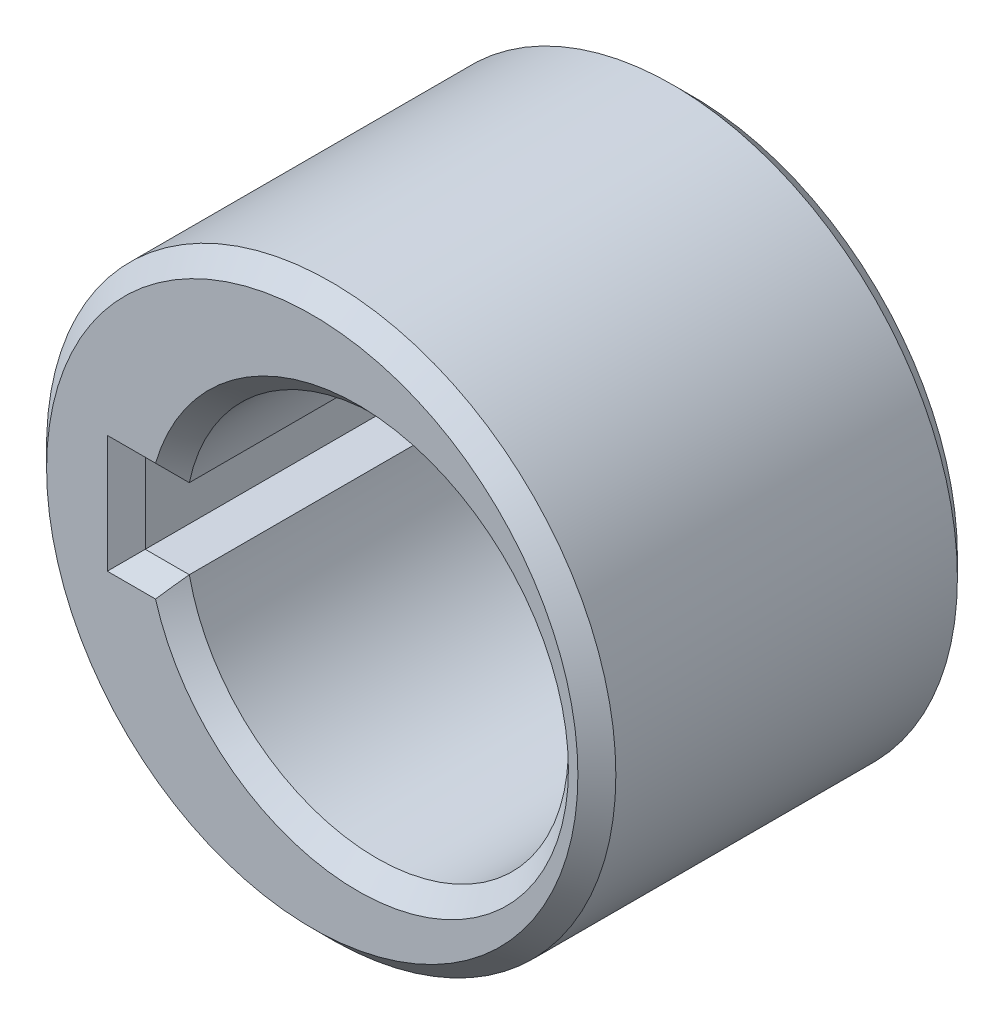
ISO-10303-21;
HEADER;
FILE_DESCRIPTION(('STEP AP214'),'2;1');
FILE_NAME('part.step','',(''),(''),'','','');
FILE_SCHEMA(('AUTOMOTIVE_DESIGN { 1 0 10303 214 1 1 1 1 }'));
ENDSEC;
DATA;
#1=APPLICATION_CONTEXT('core data for automotive mechanical design processes');
#2=APPLICATION_PROTOCOL_DEFINITION('international standard','automotive_design',2000,#1);
#3=PRODUCT_CONTEXT('',#1,'mechanical');
#4=PRODUCT('Part','Part','',(#3));
#5=PRODUCT_RELATED_PRODUCT_CATEGORY('part','',(#4));
#6=PRODUCT_DEFINITION_FORMATION('','',#4);
#7=PRODUCT_DEFINITION_CONTEXT('part definition',#1,'design');
#8=PRODUCT_DEFINITION('design','',#6,#7);
#9=PRODUCT_DEFINITION_SHAPE('','',#8);
#10=(LENGTH_UNIT() NAMED_UNIT(*) SI_UNIT(.MILLI.,.METRE.));
#11=(NAMED_UNIT(*) PLANE_ANGLE_UNIT() SI_UNIT($,.RADIAN.));
#12=(NAMED_UNIT(*) SI_UNIT($,.STERADIAN.) SOLID_ANGLE_UNIT());
#13=UNCERTAINTY_MEASURE_WITH_UNIT(LENGTH_MEASURE(1.E-05),#10,'distance_accuracy_value','');
#14=(GEOMETRIC_REPRESENTATION_CONTEXT(3) GLOBAL_UNCERTAINTY_ASSIGNED_CONTEXT((#13)) GLOBAL_UNIT_ASSIGNED_CONTEXT((#10,
#11,#12)) REPRESENTATION_CONTEXT('',''));
#15=CARTESIAN_POINT('',(0.,0.,0.));
#16=DIRECTION('',(0.,0.,1.));
#17=DIRECTION('',(1.,0.,0.));
#18=AXIS2_PLACEMENT_3D('',#15,#16,#17);
#19=CARTESIAN_POINT('',(-1.2,0.,10.));
#20=DIRECTION('',(0.,0.,1.));
#21=DIRECTION('',(1.,0.,0.));
#22=AXIS2_PLACEMENT_3D('',#19,#20,#21);
#23=PLANE('',#22);
#24=CARTESIAN_POINT('',(-1.2,0.,10.));
#25=DIRECTION('',(0.,0.,1.));
#26=DIRECTION('',(1.,0.,0.));
#27=AXIS2_PLACEMENT_3D('',#24,#25,#26);
#28=CIRCLE('',#27,7.);
#29=CARTESIAN_POINT('',(5.8,0.,10.));
#30=VERTEX_POINT('',#29);
#31=EDGE_CURVE('E11',#30,#30,#28,.T.);
#32=ORIENTED_EDGE('',*,*,#31,.T.);
#33=EDGE_LOOP('',(#32));
#34=FACE_BOUND('',#33,.T.);
#35=DIRECTION('',(-1.,0.,0.));
#36=VECTOR('',#35,1.);
#37=CARTESIAN_POINT('',(-6.1,-1.55000000000001,10.));
#38=LINE('',#37,#36);
#39=CARTESIAN_POINT('',(-5.3291650377897,-1.55,10.));
#40=VERTEX_POINT('',#39);
#41=CARTESIAN_POINT('',(-6.60000000000001,-1.55000000000001,10.));
#42=VERTEX_POINT('',#41);
#43=EDGE_CURVE('E141',#40,#42,#38,.T.);
#44=ORIENTED_EDGE('',*,*,#43,.T.);
#45=DIRECTION('',(0.,1.,0.));
#46=VECTOR('',#45,1.);
#47=CARTESIAN_POINT('',(-6.60000000000001,1.05,10.));
#48=LINE('',#47,#46);
#49=CARTESIAN_POINT('',(-6.60000000000001,1.55000000000001,10.));
#50=VERTEX_POINT('',#49);
#51=EDGE_CURVE('E123',#42,#50,#48,.T.);
#52=ORIENTED_EDGE('',*,*,#51,.T.);
#53=DIRECTION('',(1.,0.,0.));
#54=VECTOR('',#53,1.);
#55=CARTESIAN_POINT('',(-4.93963561409139,1.55000000000001,10.));
#56=LINE('',#55,#54);
#57=CARTESIAN_POINT('',(-5.3291650377897,1.55,10.));
#58=VERTEX_POINT('',#57);
#59=EDGE_CURVE('E147',#50,#58,#56,.T.);
#60=ORIENTED_EDGE('',*,*,#59,.T.);
#61=CARTESIAN_POINT('',(0.,0.,10.));
#62=DIRECTION('',(0.,0.,1.));
#63=DIRECTION('',(1.,0.,0.));
#64=AXIS2_PLACEMENT_3D('',#61,#62,#63);
#65=CIRCLE('',#64,5.55000000000001);
#66=EDGE_CURVE('E138',#58,#40,#65,.F.);
#67=ORIENTED_EDGE('',*,*,#66,.T.);
#68=EDGE_LOOP('',(#44,#52,#60,#67));
#69=FACE_BOUND('',#68,.T.);
#70=ADVANCED_FACE('F41',(#34,#69),#23,.T.);
#71=CARTESIAN_POINT('',(-1.2,0.,0.));
#72=DIRECTION('',(0.,0.,1.));
#73=DIRECTION('',(1.,0.,0.));
#74=AXIS2_PLACEMENT_3D('',#71,#72,#73);
#75=PLANE('',#74);
#76=CARTESIAN_POINT('',(-1.2,0.,0.));
#77=DIRECTION('',(0.,0.,1.));
#78=DIRECTION('',(1.,0.,0.));
#79=AXIS2_PLACEMENT_3D('',#76,#77,#78);
#80=CIRCLE('',#79,6.99999999999999);
#81=CARTESIAN_POINT('',(5.79999999999999,0.,0.));
#82=VERTEX_POINT('',#81);
#83=EDGE_CURVE('E50',#82,#82,#80,.F.);
#84=ORIENTED_EDGE('',*,*,#83,.T.);
#85=EDGE_LOOP('',(#84));
#86=FACE_BOUND('',#85,.T.);
#87=DIRECTION('',(1.,0.,0.));
#88=VECTOR('',#87,1.);
#89=CARTESIAN_POINT('',(-1.2,-1.55,0.));
#90=LINE('',#89,#88);
#91=CARTESIAN_POINT('',(-6.6,-1.55,0.));
#92=VERTEX_POINT('',#91);
#93=CARTESIAN_POINT('',(-5.32916503778969,-1.55,0.));
#94=VERTEX_POINT('',#93);
#95=EDGE_CURVE('E392',#92,#94,#90,.T.);
#96=ORIENTED_EDGE('',*,*,#95,.T.);
#97=CARTESIAN_POINT('',(0.,0.,0.));
#98=DIRECTION('',(0.,0.,1.));
#99=DIRECTION('',(1.,0.,0.));
#100=AXIS2_PLACEMENT_3D('',#97,#98,#99);
#101=CIRCLE('',#100,5.55);
#102=CARTESIAN_POINT('',(-5.32916503778969,1.55,0.));
#103=VERTEX_POINT('',#102);
#104=EDGE_CURVE('E388',#94,#103,#101,.T.);
#105=ORIENTED_EDGE('',*,*,#104,.T.);
#106=DIRECTION('',(-1.,0.,0.));
#107=VECTOR('',#106,1.);
#108=CARTESIAN_POINT('',(-1.2,1.55,0.));
#109=LINE('',#108,#107);
#110=CARTESIAN_POINT('',(-6.6,1.55,0.));
#111=VERTEX_POINT('',#110);
#112=EDGE_CURVE('E411',#103,#111,#109,.T.);
#113=ORIENTED_EDGE('',*,*,#112,.T.);
#114=DIRECTION('',(0.,-1.,0.));
#115=VECTOR('',#114,1.);
#116=CARTESIAN_POINT('',(-6.6,0.,0.));
#117=LINE('',#116,#115);
#118=EDGE_CURVE('E152',#111,#92,#117,.T.);
#119=ORIENTED_EDGE('',*,*,#118,.T.);
#120=EDGE_LOOP('',(#96,#105,#113,#119));
#121=FACE_BOUND('',#120,.T.);
#122=ADVANCED_FACE('F246',(#86,#121),#75,.F.);
#123=CARTESIAN_POINT('',(-1.2,0.,10.));
#124=DIRECTION('',(0.,0.,-1.));
#125=DIRECTION('',(-1.,0.,0.));
#126=AXIS2_PLACEMENT_3D('',#123,#124,#125);
#127=CYLINDRICAL_SURFACE('',#126,7.49999999999999);
#128=CARTESIAN_POINT('',(-1.2,0.,0.499999999999999));
#129=DIRECTION('',(0.,0.,1.));
#130=DIRECTION('',(1.,0.,0.));
#131=AXIS2_PLACEMENT_3D('',#128,#129,#130);
#132=CIRCLE('',#131,7.49999999999999);
#133=CARTESIAN_POINT('',(6.29999999999999,0.,0.499999999999999));
#134=VERTEX_POINT('',#133);
#135=EDGE_CURVE('E397',#134,#134,#132,.T.);
#136=ORIENTED_EDGE('',*,*,#135,.T.);
#137=EDGE_LOOP('',(#136));
#138=FACE_BOUND('',#137,.T.);
#139=CARTESIAN_POINT('',(-1.2,0.,9.5));
#140=DIRECTION('',(0.,0.,1.));
#141=DIRECTION('',(1.,0.,0.));
#142=AXIS2_PLACEMENT_3D('',#139,#140,#141);
#143=CIRCLE('',#142,7.49999999999999);
#144=CARTESIAN_POINT('',(6.29999999999999,0.,9.5));
#145=VERTEX_POINT('',#144);
#146=EDGE_CURVE('E395',#145,#145,#143,.F.);
#147=ORIENTED_EDGE('',*,*,#146,.T.);
#148=EDGE_LOOP('',(#147));
#149=FACE_BOUND('',#148,.T.);
#150=ADVANCED_FACE('F252',(#138,#149),#127,.T.);
#151=CARTESIAN_POINT('',(0.,0.,10.));
#152=DIRECTION('',(0.,0.,-1.));
#153=DIRECTION('',(-1.,0.,0.));
#154=AXIS2_PLACEMENT_3D('',#151,#152,#153);
#155=CYLINDRICAL_SURFACE('',#154,5.05);
#156=DIRECTION('',(0.,0.,-1.));
#157=VECTOR('',#156,1.);
#158=CARTESIAN_POINT('',(-4.93963561409139,1.05,10.));
#159=LINE('',#158,#157);
#160=CARTESIAN_POINT('',(-4.93963561409139,1.05,0.5));
#161=VERTEX_POINT('',#160);
#162=CARTESIAN_POINT('',(-4.93963561409139,1.05,9.5));
#163=VERTEX_POINT('',#162);
#164=EDGE_CURVE('E112',#161,#163,#159,.F.);
#165=ORIENTED_EDGE('',*,*,#164,.F.);
#166=CARTESIAN_POINT('',(0.,0.,0.5));
#167=DIRECTION('',(0.,0.,1.));
#168=DIRECTION('',(1.,0.,0.));
#169=AXIS2_PLACEMENT_3D('',#166,#167,#168);
#170=CIRCLE('',#169,5.05);
#171=CARTESIAN_POINT('',(-4.93963561409139,-1.05,0.5));
#172=VERTEX_POINT('',#171);
#173=EDGE_CURVE('E386',#161,#172,#170,.F.);
#174=ORIENTED_EDGE('',*,*,#173,.T.);
#175=DIRECTION('',(0.,0.,-1.));
#176=VECTOR('',#175,1.);
#177=CARTESIAN_POINT('',(-4.93963561409139,-1.05,10.));
#178=LINE('',#177,#176);
#179=CARTESIAN_POINT('',(-4.93963561409139,-1.05,9.5));
#180=VERTEX_POINT('',#179);
#181=EDGE_CURVE('E139',#180,#172,#178,.T.);
#182=ORIENTED_EDGE('',*,*,#181,.F.);
#183=CARTESIAN_POINT('',(0.,0.,9.5));
#184=DIRECTION('',(0.,0.,1.));
#185=DIRECTION('',(1.,0.,0.));
#186=AXIS2_PLACEMENT_3D('',#183,#184,#185);
#187=CIRCLE('',#186,5.05);
#188=EDGE_CURVE('E133',#180,#163,#187,.T.);
#189=ORIENTED_EDGE('',*,*,#188,.T.);
#190=EDGE_LOOP('',(#165,#174,#182,#189));
#191=FACE_BOUND('',#190,.T.);
#192=ADVANCED_FACE('F257',(#191),#155,.F.);
#193=CARTESIAN_POINT('',(0.,-1.05,0.));
#194=DIRECTION('',(0.,-1.,0.));
#195=DIRECTION('',(1.,0.,0.));
#196=AXIS2_PLACEMENT_3D('',#193,#194,#195);
#197=PLANE('',#196);
#198=ORIENTED_EDGE('',*,*,#181,.T.);
#199=DIRECTION('',(-1.,0.,0.));
#200=VECTOR('',#199,1.);
#201=CARTESIAN_POINT('',(0.,-1.05,0.5));
#202=LINE('',#201,#200);
#203=CARTESIAN_POINT('',(-6.1,-1.05,0.5));
#204=VERTEX_POINT('',#203);
#205=EDGE_CURVE('E65',#172,#204,#202,.T.);
#206=ORIENTED_EDGE('',*,*,#205,.T.);
#207=DIRECTION('',(0.,0.,1.));
#208=VECTOR('',#207,1.);
#209=CARTESIAN_POINT('',(-6.1,-1.05,0.));
#210=LINE('',#209,#208);
#211=CARTESIAN_POINT('',(-6.1,-1.05,9.5));
#212=VERTEX_POINT('',#211);
#213=EDGE_CURVE('E105',#204,#212,#210,.T.);
#214=ORIENTED_EDGE('',*,*,#213,.T.);
#215=DIRECTION('',(1.,0.,0.));
#216=VECTOR('',#215,1.);
#217=CARTESIAN_POINT('',(-4.93963561409139,-1.05,9.5));
#218=LINE('',#217,#216);
#219=EDGE_CURVE('E109',#212,#180,#218,.T.);
#220=ORIENTED_EDGE('',*,*,#219,.T.);
#221=EDGE_LOOP('',(#198,#206,#214,#220));
#222=FACE_BOUND('',#221,.T.);
#223=ADVANCED_FACE('F107',(#222),#197,.F.);
#224=CARTESIAN_POINT('',(-6.1,1.05,0.));
#225=DIRECTION('',(-1.,0.,0.));
#226=DIRECTION('',(0.,0.,1.));
#227=AXIS2_PLACEMENT_3D('',#224,#225,#226);
#228=PLANE('',#227);
#229=ORIENTED_EDGE('',*,*,#213,.F.);
#230=DIRECTION('',(0.,1.,0.));
#231=VECTOR('',#230,1.);
#232=CARTESIAN_POINT('',(-6.1,1.05,0.5));
#233=LINE('',#232,#231);
#234=CARTESIAN_POINT('',(-6.1,1.05,0.5));
#235=VERTEX_POINT('',#234);
#236=EDGE_CURVE('E57',#204,#235,#233,.T.);
#237=ORIENTED_EDGE('',*,*,#236,.T.);
#238=DIRECTION('',(0.,0.,1.));
#239=VECTOR('',#238,1.);
#240=CARTESIAN_POINT('',(-6.1,1.05,0.));
#241=LINE('',#240,#239);
#242=CARTESIAN_POINT('',(-6.1,1.05,9.5));
#243=VERTEX_POINT('',#242);
#244=EDGE_CURVE('E113',#235,#243,#241,.T.);
#245=ORIENTED_EDGE('',*,*,#244,.T.);
#246=DIRECTION('',(0.,-1.,0.));
#247=VECTOR('',#246,1.);
#248=CARTESIAN_POINT('',(-6.1,-1.05,9.5));
#249=LINE('',#248,#247);
#250=EDGE_CURVE('E121',#243,#212,#249,.T.);
#251=ORIENTED_EDGE('',*,*,#250,.T.);
#252=EDGE_LOOP('',(#229,#237,#245,#251));
#253=FACE_BOUND('',#252,.T.);
#254=ADVANCED_FACE('F136',(#253),#228,.F.);
#255=CARTESIAN_POINT('',(0.,1.05,0.));
#256=DIRECTION('',(0.,1.,0.));
#257=DIRECTION('',(-1.,0.,0.));
#258=AXIS2_PLACEMENT_3D('',#255,#256,#257);
#259=PLANE('',#258);
#260=ORIENTED_EDGE('',*,*,#244,.F.);
#261=DIRECTION('',(1.,0.,0.));
#262=VECTOR('',#261,1.);
#263=CARTESIAN_POINT('',(0.,1.05,0.5));
#264=LINE('',#263,#262);
#265=EDGE_CURVE('E383',#235,#161,#264,.T.);
#266=ORIENTED_EDGE('',*,*,#265,.T.);
#267=ORIENTED_EDGE('',*,*,#164,.T.);
#268=DIRECTION('',(-1.,0.,0.));
#269=VECTOR('',#268,1.);
#270=CARTESIAN_POINT('',(-6.1,1.05,9.5));
#271=LINE('',#270,#269);
#272=EDGE_CURVE('E134',#163,#243,#271,.T.);
#273=ORIENTED_EDGE('',*,*,#272,.T.);
#274=EDGE_LOOP('',(#260,#266,#267,#273));
#275=FACE_BOUND('',#274,.T.);
#276=ADVANCED_FACE('F291',(#275),#259,.F.);
#277=CARTESIAN_POINT('',(0.,0.,9.5));
#278=DIRECTION('',(0.,0.,1.));
#279=DIRECTION('',(1.,0.,0.));
#280=AXIS2_PLACEMENT_3D('',#277,#278,#279);
#281=CONICAL_SURFACE('',#280,5.05,0.785398163397452);
#282=CARTESIAN_POINT('',(-4.93963561409139,-1.05,9.5));
#283=CARTESIAN_POINT('',(-4.97306727438379,-1.09128547069311,9.5412854706931));
#284=CARTESIAN_POINT('',(-5.00624373290037,-1.1326740882986,9.5826740882986));
#285=CARTESIAN_POINT('',(-5.07210348665936,-1.2156435789909,9.66564357899089));
#286=CARTESIAN_POINT('',(-5.10478681344634,-1.25722443955614,9.70722443955613));
#287=CARTESIAN_POINT('',(-5.16968159226311,-1.34056937418893,9.79056937418892));
#288=CARTESIAN_POINT('',(-5.20189304781298,-1.38233344688673,9.83233344688672));
#289=CARTESIAN_POINT('',(-5.26586408278406,-1.46603776209883,9.91603776209882));
#290=CARTESIAN_POINT('',(-5.29762363304362,-1.507978015758,9.95797801575799));
#291=CARTESIAN_POINT('',(-5.32916503779029,-1.54999999999978,9.99999999999977));
#292=B_SPLINE_CURVE_WITH_KNOTS('',3,(#282,#283,#284,#285,#286,#287,#288,#289,#290,#291),
.UNSPECIFIED.,.F.,.F.,(4,2,2,2,4),(0.,0.201840325274075,0.403667684050677,0.605493536465258,
0.807332354265636),.UNSPECIFIED.);
#293=EDGE_CURVE('E132',#40,#180,#292,.F.);
#294=ORIENTED_EDGE('',*,*,#293,.F.);
#295=ORIENTED_EDGE('',*,*,#66,.F.);
#296=CARTESIAN_POINT('',(-5.32916503778972,1.55000000000001,10.));
#297=CARTESIAN_POINT('',(-5.29762363304341,1.50797801575809,9.95797801575808));
#298=CARTESIAN_POINT('',(-5.26586408278401,1.46603776209885,9.91603776209885));
#299=CARTESIAN_POINT('',(-5.20189304781305,1.38233344688671,9.8323334468867));
#300=CARTESIAN_POINT('',(-5.16968159226314,1.34056937418892,9.79056937418891));
#301=CARTESIAN_POINT('',(-5.10478681344632,1.25722443955615,9.70722443955614));
#302=CARTESIAN_POINT('',(-5.07210348665933,1.21564357899091,9.66564357899091));
#303=CARTESIAN_POINT('',(-5.0062437329004,1.13267408829859,9.58267408829859));
#304=CARTESIAN_POINT('',(-4.9730672743839,1.09128547069307,9.54128547069307));
#305=CARTESIAN_POINT('',(-4.93963561409164,1.0499999999999,9.4999999999999));
#306=B_SPLINE_CURVE_WITH_KNOTS('',3,(#296,#297,#298,#299,#300,#301,#302,#303,#304,#305),
.UNSPECIFIED.,.F.,.F.,(4,2,2,2,4),(0.,0.201838817800386,0.403664670214972,0.605492028991571,
0.807332354265648),.UNSPECIFIED.);
#307=EDGE_CURVE('E162',#163,#58,#306,.F.);
#308=ORIENTED_EDGE('',*,*,#307,.F.);
#309=ORIENTED_EDGE('',*,*,#188,.F.);
#310=EDGE_LOOP('',(#294,#295,#308,#309));
#311=FACE_BOUND('',#310,.T.);
#312=ADVANCED_FACE('F170',(#311),#281,.F.);
#313=CARTESIAN_POINT('',(0.,1.05,9.5));
#314=DIRECTION('',(0.,-0.707106781186545,0.70710678118655));
#315=DIRECTION('',(1.,0.,0.));
#316=AXIS2_PLACEMENT_3D('',#313,#314,#315);
#317=PLANE('',#316);
#318=ORIENTED_EDGE('',*,*,#307,.T.);
#319=ORIENTED_EDGE('',*,*,#59,.F.);
#320=DIRECTION('',(0.577350269189627,-0.577350269189627,-0.577350269189623));
#321=VECTOR('',#320,1.);
#322=CARTESIAN_POINT('',(-6.1,1.05,9.5));
#323=LINE('',#322,#321);
#324=EDGE_CURVE('E126',#243,#50,#323,.F.);
#325=ORIENTED_EDGE('',*,*,#324,.F.);
#326=ORIENTED_EDGE('',*,*,#272,.F.);
#327=EDGE_LOOP('',(#318,#319,#325,#326));
#328=FACE_BOUND('',#327,.T.);
#329=ADVANCED_FACE('F179',(#328),#317,.T.);
#330=CARTESIAN_POINT('',(0.,-1.05,9.5));
#331=DIRECTION('',(0.,0.707106781186545,0.70710678118655));
#332=DIRECTION('',(-1.,0.,0.));
#333=AXIS2_PLACEMENT_3D('',#330,#331,#332);
#334=PLANE('',#333);
#335=ORIENTED_EDGE('',*,*,#293,.T.);
#336=ORIENTED_EDGE('',*,*,#219,.F.);
#337=DIRECTION('',(-0.577350269189627,-0.577350269189627,0.577350269189623));
#338=VECTOR('',#337,1.);
#339=CARTESIAN_POINT('',(-5.4,-0.349999999999999,8.8));
#340=LINE('',#339,#338);
#341=EDGE_CURVE('E119',#42,#212,#340,.F.);
#342=ORIENTED_EDGE('',*,*,#341,.F.);
#343=ORIENTED_EDGE('',*,*,#43,.F.);
#344=EDGE_LOOP('',(#335,#336,#342,#343));
#345=FACE_BOUND('',#344,.T.);
#346=ADVANCED_FACE('F130',(#345),#334,.T.);
#347=CARTESIAN_POINT('',(-6.1,1.05,9.5));
#348=DIRECTION('',(0.707106781186545,0.,0.70710678118655));
#349=DIRECTION('',(0.,1.,0.));
#350=AXIS2_PLACEMENT_3D('',#347,#348,#349);
#351=PLANE('',#350);
#352=ORIENTED_EDGE('',*,*,#324,.T.);
#353=ORIENTED_EDGE('',*,*,#51,.F.);
#354=ORIENTED_EDGE('',*,*,#341,.T.);
#355=ORIENTED_EDGE('',*,*,#250,.F.);
#356=EDGE_LOOP('',(#352,#353,#354,#355));
#357=FACE_BOUND('',#356,.T.);
#358=ADVANCED_FACE('F120',(#357),#351,.T.);
#359=CARTESIAN_POINT('',(-6.6,0.,0.));
#360=DIRECTION('',(-0.70710678118655,0.,0.707106781186545));
#361=DIRECTION('',(0.,-1.,0.));
#362=AXIS2_PLACEMENT_3D('',#359,#360,#361);
#363=PLANE('',#362);
#364=DIRECTION('',(0.577350269189625,-0.577350269189624,0.577350269189629));
#365=VECTOR('',#364,1.);
#366=CARTESIAN_POINT('',(-4.80000000000001,-0.249999999999994,1.8));
#367=LINE('',#366,#365);
#368=EDGE_CURVE('E215',#235,#111,#367,.F.);
#369=ORIENTED_EDGE('',*,*,#368,.F.);
#370=ORIENTED_EDGE('',*,*,#236,.F.);
#371=DIRECTION('',(-0.577350269189624,-0.577350269189625,-0.577350269189628));
#372=VECTOR('',#371,1.);
#373=CARTESIAN_POINT('',(-4.80000000000001,0.249999999999992,1.8));
#374=LINE('',#373,#372);
#375=EDGE_CURVE('E127',#92,#204,#374,.F.);
#376=ORIENTED_EDGE('',*,*,#375,.F.);
#377=ORIENTED_EDGE('',*,*,#118,.F.);
#378=EDGE_LOOP('',(#369,#370,#376,#377));
#379=FACE_BOUND('',#378,.T.);
#380=ADVANCED_FACE('F224',(#379),#363,.F.);
#381=CARTESIAN_POINT('',(-1.2,-1.55,0.));
#382=DIRECTION('',(0.,-0.70710678118655,0.707106781186545));
#383=DIRECTION('',(1.,0.,0.));
#384=AXIS2_PLACEMENT_3D('',#381,#382,#383);
#385=PLANE('',#384);
#386=ORIENTED_EDGE('',*,*,#375,.T.);
#387=ORIENTED_EDGE('',*,*,#205,.F.);
#388=CARTESIAN_POINT('',(-4.93963561409139,-1.05,0.5));
#389=CARTESIAN_POINT('',(-4.97306727438379,-1.09128547069311,0.458714529306893));
#390=CARTESIAN_POINT('',(-5.00624373290036,-1.1326740882986,0.4173259117014));
#391=CARTESIAN_POINT('',(-5.07210348665936,-1.21564357899089,0.334356421009108));
#392=CARTESIAN_POINT('',(-5.10478681344634,-1.25722443955613,0.292775560443872));
#393=CARTESIAN_POINT('',(-5.16968159226311,-1.34056937418892,0.209430625811084));
#394=CARTESIAN_POINT('',(-5.20189304781297,-1.38233344688672,0.167666553113284));
#395=CARTESIAN_POINT('',(-5.26586408278405,-1.46603776209881,0.0839622379011903));
#396=CARTESIAN_POINT('',(-5.2976236330436,-1.50797801575798,0.0420219842420203));
#397=CARTESIAN_POINT('',(-5.32916503779027,-1.54999999999976,2.39704921342796E-13));
#398=B_SPLINE_CURVE_WITH_KNOTS('',3,(#388,#389,#390,#391,#392,#393,#394,#395,#396,#397),
.UNSPECIFIED.,.F.,.F.,(4,2,2,2,4),(0.,0.201840325274071,0.403667684050665,0.605493536465238,
0.807332354265611),.UNSPECIFIED.);
#399=EDGE_CURVE('E208',#94,#172,#398,.F.);
#400=ORIENTED_EDGE('',*,*,#399,.F.);
#401=ORIENTED_EDGE('',*,*,#95,.F.);
#402=EDGE_LOOP('',(#386,#387,#400,#401));
#403=FACE_BOUND('',#402,.T.);
#404=ADVANCED_FACE('F196',(#403),#385,.F.);
#405=CARTESIAN_POINT('',(-1.2,1.55,0.));
#406=DIRECTION('',(0.,0.70710678118655,0.707106781186545));
#407=DIRECTION('',(-1.,0.,0.));
#408=AXIS2_PLACEMENT_3D('',#405,#406,#407);
#409=PLANE('',#408);
#410=ORIENTED_EDGE('',*,*,#368,.T.);
#411=ORIENTED_EDGE('',*,*,#112,.F.);
#412=CARTESIAN_POINT('',(-5.32916503778969,1.54999999999999,0.));
#413=CARTESIAN_POINT('',(-5.29762363304339,1.50797801575807,0.0420219842419243));
#414=CARTESIAN_POINT('',(-5.265864082784,1.46603776209884,0.083962237901157));
#415=CARTESIAN_POINT('',(-5.20189304781304,1.3823334468867,0.1676665531133));
#416=CARTESIAN_POINT('',(-5.16968159226314,1.34056937418891,0.209430625811088));
#417=CARTESIAN_POINT('',(-5.10478681344632,1.25722443955614,0.292775560443858));
#418=CARTESIAN_POINT('',(-5.07210348665933,1.21564357899091,0.33435642100909));
#419=CARTESIAN_POINT('',(-5.0062437329004,1.13267408829859,0.417325911701408));
#420=CARTESIAN_POINT('',(-4.9730672743839,1.09128547069307,0.458714529306931));
#421=CARTESIAN_POINT('',(-4.93963561409164,1.0499999999999,0.500000000000096));
#422=B_SPLINE_CURVE_WITH_KNOTS('',3,(#412,#413,#414,#415,#416,#417,#418,#419,#420,#421),
.UNSPECIFIED.,.F.,.F.,(4,2,2,2,4),(0.,0.201838817800379,0.403664670214957,0.605492028991551,
0.807332354265622),.UNSPECIFIED.);
#423=EDGE_CURVE('E201',#161,#103,#422,.F.);
#424=ORIENTED_EDGE('',*,*,#423,.F.);
#425=ORIENTED_EDGE('',*,*,#265,.F.);
#426=EDGE_LOOP('',(#410,#411,#424,#425));
#427=FACE_BOUND('',#426,.T.);
#428=ADVANCED_FACE('F187',(#427),#409,.F.);
#429=CARTESIAN_POINT('',(0.,0.,0.));
#430=DIRECTION('',(0.,0.,-1.));
#431=DIRECTION('',(-1.,0.,0.));
#432=AXIS2_PLACEMENT_3D('',#429,#430,#431);
#433=CONICAL_SURFACE('',#432,5.55,0.785398163397445);
#434=ORIENTED_EDGE('',*,*,#399,.T.);
#435=ORIENTED_EDGE('',*,*,#173,.F.);
#436=ORIENTED_EDGE('',*,*,#423,.T.);
#437=ORIENTED_EDGE('',*,*,#104,.F.);
#438=EDGE_LOOP('',(#434,#435,#436,#437));
#439=FACE_BOUND('',#438,.T.);
#440=ADVANCED_FACE('F195',(#439),#433,.F.);
#441=CARTESIAN_POINT('',(-1.2,0.,0.499999999999999));
#442=DIRECTION('',(0.,0.,1.));
#443=DIRECTION('',(1.,0.,0.));
#444=AXIS2_PLACEMENT_3D('',#441,#442,#443);
#445=CONICAL_SURFACE('',#444,7.49999999999999,0.785398163397448);
#446=ORIENTED_EDGE('',*,*,#83,.F.);
#447=EDGE_LOOP('',(#446));
#448=FACE_BOUND('',#447,.T.);
#449=ORIENTED_EDGE('',*,*,#135,.F.);
#450=EDGE_LOOP('',(#449));
#451=FACE_BOUND('',#450,.T.);
#452=ADVANCED_FACE('F231',(#448,#451),#445,.T.);
#453=CARTESIAN_POINT('',(-1.2,0.,10.));
#454=DIRECTION('',(0.,0.,-1.));
#455=DIRECTION('',(-1.,0.,0.));
#456=AXIS2_PLACEMENT_3D('',#453,#454,#455);
#457=CONICAL_SURFACE('',#456,7.,0.785398163397448);
#458=ORIENTED_EDGE('',*,*,#146,.F.);
#459=EDGE_LOOP('',(#458));
#460=FACE_BOUND('',#459,.T.);
#461=ORIENTED_EDGE('',*,*,#31,.F.);
#462=EDGE_LOOP('',(#461));
#463=FACE_BOUND('',#462,.T.);
#464=ADVANCED_FACE('F44',(#460,#463),#457,.T.);
#465=CLOSED_SHELL('',(#70,#122,#150,#192,#223,#254,#276,#312,#329,#346,#358,#380,#404,#428,#440,
#452,#464));
#466=MANIFOLD_SOLID_BREP('B2',#465);
#467=ADVANCED_BREP_SHAPE_REPRESENTATION('',(#18,#466),#14);
#468=SHAPE_DEFINITION_REPRESENTATION(#9,#467);
ENDSEC;
END-ISO-10303-21;
